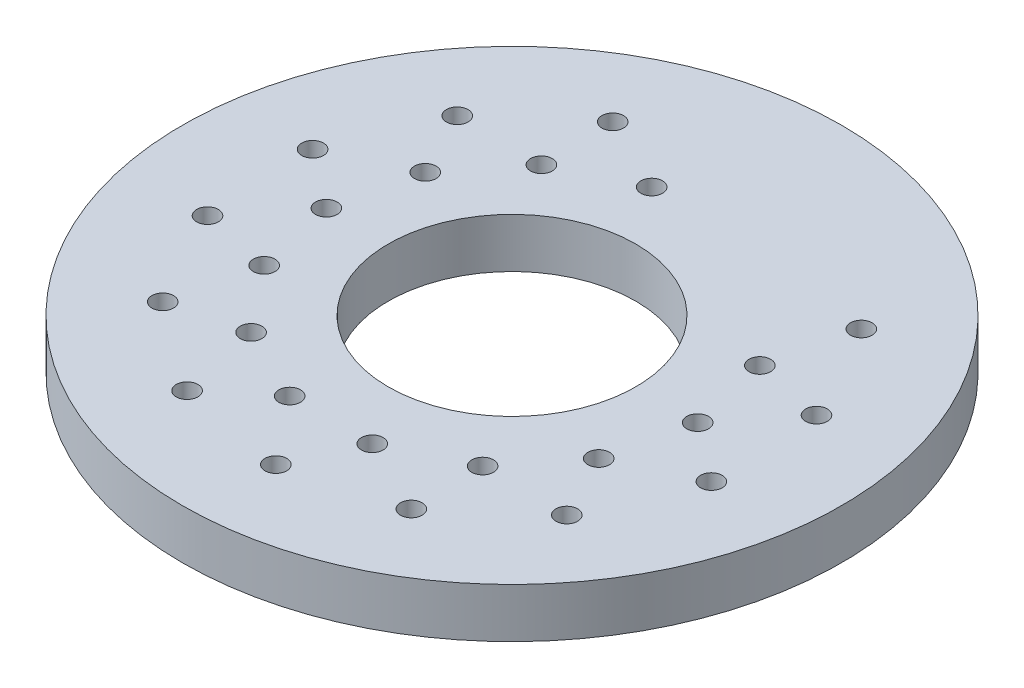
ISO-10303-21;
HEADER;
FILE_DESCRIPTION(('STEP AP214'),'2;1');
FILE_NAME('part.step','',(''),(''),'','','');
FILE_SCHEMA(('AUTOMOTIVE_DESIGN { 1 0 10303 214 1 1 1 1 }'));
ENDSEC;
DATA;
#1=APPLICATION_CONTEXT('core data for automotive mechanical design processes');
#2=APPLICATION_PROTOCOL_DEFINITION('international standard','automotive_design',2000,#1);
#3=PRODUCT_CONTEXT('',#1,'mechanical');
#4=PRODUCT('Part','Part','',(#3));
#5=PRODUCT_RELATED_PRODUCT_CATEGORY('part','',(#4));
#6=PRODUCT_DEFINITION_FORMATION('','',#4);
#7=PRODUCT_DEFINITION_CONTEXT('part definition',#1,'design');
#8=PRODUCT_DEFINITION('design','',#6,#7);
#9=PRODUCT_DEFINITION_SHAPE('','',#8);
#10=(LENGTH_UNIT() NAMED_UNIT(*) SI_UNIT(.MILLI.,.METRE.));
#11=(NAMED_UNIT(*) PLANE_ANGLE_UNIT() SI_UNIT($,.RADIAN.));
#12=(NAMED_UNIT(*) SI_UNIT($,.STERADIAN.) SOLID_ANGLE_UNIT());
#13=UNCERTAINTY_MEASURE_WITH_UNIT(LENGTH_MEASURE(1.E-05),#10,'distance_accuracy_value','');
#14=(GEOMETRIC_REPRESENTATION_CONTEXT(3) GLOBAL_UNCERTAINTY_ASSIGNED_CONTEXT((#13)) GLOBAL_UNIT_ASSIGNED_CONTEXT((#10,
#11,#12)) REPRESENTATION_CONTEXT('',''));
#15=CARTESIAN_POINT('',(0.,0.,0.));
#16=DIRECTION('',(0.,0.,1.));
#17=DIRECTION('',(1.,0.,0.));
#18=AXIS2_PLACEMENT_3D('',#15,#16,#17);
#19=CARTESIAN_POINT('',(-21.7363200137049,1.6,-18.9571139209193));
#20=DIRECTION('',(0.,-1.,0.));
#21=DIRECTION('',(0.,0.,-1.));
#22=AXIS2_PLACEMENT_3D('',#19,#20,#21);
#23=CYLINDRICAL_SURFACE('',#22,10.6500000000003);
#24=CARTESIAN_POINT('',(-21.7363200137049,1.6,-18.9571139209193));
#25=DIRECTION('',(0.,1.,0.));
#26=DIRECTION('',(0.,0.,1.));
#27=AXIS2_PLACEMENT_3D('',#24,#25,#26);
#28=CIRCLE('',#27,10.6500000000003);
#29=CARTESIAN_POINT('',(-21.7363200137049,1.6,-8.30711392091903));
#30=VERTEX_POINT('',#29);
#31=EDGE_CURVE('E10',#30,#30,#28,.T.);
#32=ORIENTED_EDGE('',*,*,#31,.F.);
#33=EDGE_LOOP('',(#32));
#34=FACE_BOUND('',#33,.T.);
#35=CARTESIAN_POINT('',(-21.7363200137049,0.,-18.9571139209193));
#36=DIRECTION('',(0.,1.,0.));
#37=DIRECTION('',(0.,0.,1.));
#38=AXIS2_PLACEMENT_3D('',#35,#36,#37);
#39=CIRCLE('',#38,10.6500000000003);
#40=CARTESIAN_POINT('',(-21.7363200137049,0.,-8.30711392091903));
#41=VERTEX_POINT('',#40);
#42=EDGE_CURVE('E37',#41,#41,#39,.T.);
#43=ORIENTED_EDGE('',*,*,#42,.T.);
#44=EDGE_LOOP('',(#43));
#45=FACE_BOUND('',#44,.T.);
#46=ADVANCED_FACE('F30',(#34,#45),#23,.T.);
#47=CARTESIAN_POINT('',(-21.7363200137049,1.6,-18.9571139209193));
#48=DIRECTION('',(0.,1.,0.));
#49=DIRECTION('',(0.,0.,1.));
#50=AXIS2_PLACEMENT_3D('',#47,#48,#49);
#51=PLANE('',#50);
#52=CARTESIAN_POINT('',(-21.377401370901,1.6,-10.9651693885888));
#53=DIRECTION('',(0.,1.,0.));
#54=DIRECTION('',(0.,0.,1.));
#55=AXIS2_PLACEMENT_3D('',#52,#53,#54);
#56=CIRCLE('',#55,0.350000000000001);
#57=CARTESIAN_POINT('',(-21.377401370901,1.6,-10.6151693885888));
#58=VERTEX_POINT('',#57);
#59=EDGE_CURVE('E100',#58,#58,#56,.T.);
#60=ORIENTED_EDGE('',*,*,#59,.F.);
#61=EDGE_LOOP('',(#60));
#62=FACE_BOUND('',#61,.T.);
#63=CARTESIAN_POINT('',(-17.9453707139211,1.6,-11.9123496660653));
#64=DIRECTION('',(0.,1.,0.));
#65=DIRECTION('',(0.,0.,1.));
#66=AXIS2_PLACEMENT_3D('',#63,#64,#65);
#67=CIRCLE('',#66,0.350000000000004);
#68=CARTESIAN_POINT('',(-17.9453707139211,1.6,-11.5623496660653));
#69=VERTEX_POINT('',#68);
#70=EDGE_CURVE('E90',#69,#69,#67,.T.);
#71=ORIENTED_EDGE('',*,*,#70,.F.);
#72=EDGE_LOOP('',(#71));
#73=FACE_BOUND('',#72,.T.);
#74=CARTESIAN_POINT('',(-15.2641840587054,1.6,-14.2548319025794));
#75=DIRECTION('',(0.,1.,0.));
#76=DIRECTION('',(0.,0.,1.));
#77=AXIS2_PLACEMENT_3D('',#74,#75,#76);
#78=CIRCLE('',#77,0.350000000000006);
#79=CARTESIAN_POINT('',(-15.2641840587054,1.6,-13.9048319025794));
#80=VERTEX_POINT('',#79);
#81=EDGE_CURVE('E87',#80,#80,#78,.T.);
#82=ORIENTED_EDGE('',*,*,#81,.F.);
#83=EDGE_LOOP('',(#82));
#84=FACE_BOUND('',#83,.T.);
#85=CARTESIAN_POINT('',(-13.8648833049159,1.6,-17.5286587625301));
#86=DIRECTION('',(0.,1.,0.));
#87=DIRECTION('',(0.,0.,1.));
#88=AXIS2_PLACEMENT_3D('',#85,#86,#87);
#89=CIRCLE('',#88,0.350000000000001);
#90=CARTESIAN_POINT('',(-13.8648833049159,1.6,-17.1786587625301));
#91=VERTEX_POINT('',#90);
#92=EDGE_CURVE('E84',#91,#91,#89,.T.);
#93=ORIENTED_EDGE('',*,*,#92,.F.);
#94=EDGE_LOOP('',(#93));
#95=FACE_BOUND('',#94,.T.);
#96=CARTESIAN_POINT('',(-24.8805202669364,1.6,-11.6008917405077));
#97=DIRECTION('',(0.,1.,0.));
#98=DIRECTION('',(0.,0.,1.));
#99=AXIS2_PLACEMENT_3D('',#96,#97,#98);
#100=CIRCLE('',#99,0.350000000000002);
#101=CARTESIAN_POINT('',(-24.8805202669364,1.6,-11.2508917405077));
#102=VERTEX_POINT('',#101);
#103=EDGE_CURVE('E80',#102,#102,#100,.T.);
#104=ORIENTED_EDGE('',*,*,#103,.F.);
#105=EDGE_LOOP('',(#104));
#106=FACE_BOUND('',#105,.T.);
#107=CARTESIAN_POINT('',(-14.024617128138,1.6,-21.0854086854526));
#108=DIRECTION('',(0.,1.,0.));
#109=DIRECTION('',(0.,0.,1.));
#110=AXIS2_PLACEMENT_3D('',#107,#108,#109);
#111=CIRCLE('',#110,0.350000000000003);
#112=CARTESIAN_POINT('',(-14.024617128138,1.6,-20.7354086854526));
#113=VERTEX_POINT('',#112);
#114=EDGE_CURVE('E76',#113,#113,#111,.T.);
#115=ORIENTED_EDGE('',*,*,#114,.F.);
#116=EDGE_LOOP('',(#115));
#117=FACE_BOUND('',#116,.T.);
#118=CARTESIAN_POINT('',(-15.7117482856759,1.6,-24.2206237284369));
#119=DIRECTION('',(0.,1.,0.));
#120=DIRECTION('',(0.,0.,1.));
#121=AXIS2_PLACEMENT_3D('',#118,#119,#120);
#122=CIRCLE('',#121,0.350000000000001);
#123=CARTESIAN_POINT('',(-15.7117482856759,1.6,-23.8706237284369));
#124=VERTEX_POINT('',#123);
#125=EDGE_CURVE('E72',#124,#124,#122,.T.);
#126=ORIENTED_EDGE('',*,*,#125,.F.);
#127=EDGE_LOOP('',(#126));
#128=FACE_BOUND('',#127,.T.);
#129=CARTESIAN_POINT('',(-25.5272693134888,1.6,-26.0018781757733));
#130=DIRECTION('',(0.,1.,0.));
#131=DIRECTION('',(0.,0.,1.));
#132=AXIS2_PLACEMENT_3D('',#129,#130,#131);
#133=CIRCLE('',#132,0.350000000000001);
#134=CARTESIAN_POINT('',(-25.5272693134888,1.6,-25.6518781757733));
#135=VERTEX_POINT('',#134);
#136=EDGE_CURVE('E68',#135,#135,#133,.T.);
#137=ORIENTED_EDGE('',*,*,#136,.F.);
#138=EDGE_LOOP('',(#137));
#139=FACE_BOUND('',#138,.T.);
#140=CARTESIAN_POINT('',(-28.2084559687044,1.6,-23.6593959392592));
#141=DIRECTION('',(0.,1.,0.));
#142=DIRECTION('',(0.,0.,1.));
#143=AXIS2_PLACEMENT_3D('',#140,#141,#142);
#144=CIRCLE('',#143,0.350000000000001);
#145=CARTESIAN_POINT('',(-28.2084559687044,1.6,-23.3093959392592));
#146=VERTEX_POINT('',#145);
#147=EDGE_CURVE('E64',#146,#146,#144,.T.);
#148=ORIENTED_EDGE('',*,*,#147,.F.);
#149=EDGE_LOOP('',(#148));
#150=FACE_BOUND('',#149,.T.);
#151=CARTESIAN_POINT('',(-29.6077567224939,1.6,-20.3855690793085));
#152=DIRECTION('',(0.,1.,0.));
#153=DIRECTION('',(0.,0.,1.));
#154=AXIS2_PLACEMENT_3D('',#151,#152,#153);
#155=CIRCLE('',#154,0.350000000000001);
#156=CARTESIAN_POINT('',(-29.6077567224939,1.6,-20.0355690793085));
#157=VERTEX_POINT('',#156);
#158=EDGE_CURVE('E60',#157,#157,#155,.T.);
#159=ORIENTED_EDGE('',*,*,#158,.F.);
#160=EDGE_LOOP('',(#159));
#161=FACE_BOUND('',#160,.T.);
#162=CARTESIAN_POINT('',(-29.4480228992717,1.6,-16.828819156386));
#163=DIRECTION('',(0.,1.,0.));
#164=DIRECTION('',(0.,0.,1.));
#165=AXIS2_PLACEMENT_3D('',#162,#163,#164);
#166=CIRCLE('',#165,0.349999999999998);
#167=CARTESIAN_POINT('',(-29.4480228992717,1.6,-16.478819156386));
#168=VERTEX_POINT('',#167);
#169=EDGE_CURVE('E56',#168,#168,#166,.T.);
#170=ORIENTED_EDGE('',*,*,#169,.F.);
#171=EDGE_LOOP('',(#170));
#172=FACE_BOUND('',#171,.T.);
#173=CARTESIAN_POINT('',(-27.7608917417338,1.6,-13.6936041134017));
#174=DIRECTION('',(0.,1.,0.));
#175=DIRECTION('',(0.,0.,1.));
#176=AXIS2_PLACEMENT_3D('',#173,#174,#175);
#177=CIRCLE('',#176,0.350000000000001);
#178=CARTESIAN_POINT('',(-27.7608917417338,1.6,-13.3436041134017));
#179=VERTEX_POINT('',#178);
#180=EDGE_CURVE('E52',#179,#179,#177,.T.);
#181=ORIENTED_EDGE('',*,*,#180,.F.);
#182=EDGE_LOOP('',(#181));
#183=FACE_BOUND('',#182,.T.);
#184=CARTESIAN_POINT('',(-21.7363200137049,1.6,-18.9571139209193));
#185=DIRECTION('',(0.,1.,0.));
#186=DIRECTION('',(0.,0.,1.));
#187=AXIS2_PLACEMENT_3D('',#184,#185,#186);
#188=CIRCLE('',#187,4.);
#189=CARTESIAN_POINT('',(-21.7363200137049,1.6,-14.9571139209193));
#190=VERTEX_POINT('',#189);
#191=EDGE_CURVE('E51',#190,#190,#188,.T.);
#192=ORIENTED_EDGE('',*,*,#191,.F.);
#193=EDGE_LOOP('',(#192));
#194=FACE_BOUND('',#193,.T.);
#195=CARTESIAN_POINT('',(-27.1421332211194,1.6,-16.353811486214));
#196=DIRECTION('',(0.,1.,0.));
#197=DIRECTION('',(0.,0.,1.));
#198=AXIS2_PLACEMENT_3D('',#195,#196,#197);
#199=CIRCLE('',#198,0.350000000000003);
#200=CARTESIAN_POINT('',(-27.1421332211194,1.6,-16.003811486214));
#201=VERTEX_POINT('',#200);
#202=EDGE_CURVE('E124',#201,#201,#199,.T.);
#203=ORIENTED_EDGE('',*,*,#202,.F.);
#204=EDGE_LOOP('',(#203));
#205=FACE_BOUND('',#204,.T.);
#206=CARTESIAN_POINT('',(-27.7363200137049,1.6,-18.9571139209193));
#207=DIRECTION('',(0.,1.,0.));
#208=DIRECTION('',(0.,0.,1.));
#209=AXIS2_PLACEMENT_3D('',#206,#207,#208);
#210=CIRCLE('',#209,0.350000000000001);
#211=CARTESIAN_POINT('',(-27.7363200137049,1.6,-18.6071139209193));
#212=VERTEX_POINT('',#211);
#213=EDGE_CURVE('E130',#212,#212,#210,.T.);
#214=ORIENTED_EDGE('',*,*,#213,.F.);
#215=EDGE_LOOP('',(#214));
#216=FACE_BOUND('',#215,.T.);
#217=CARTESIAN_POINT('',(-25.4772588248574,1.6,-14.2661250261112));
#218=DIRECTION('',(0.,1.,0.));
#219=DIRECTION('',(0.,0.,1.));
#220=AXIS2_PLACEMENT_3D('',#217,#218,#219);
#221=CIRCLE('',#220,0.350000000000002);
#222=CARTESIAN_POINT('',(-25.4772588248574,1.6,-13.9161250261112));
#223=VERTEX_POINT('',#222);
#224=EDGE_CURVE('E136',#223,#223,#221,.T.);
#225=ORIENTED_EDGE('',*,*,#224,.F.);
#226=EDGE_LOOP('',(#225));
#227=FACE_BOUND('',#226,.T.);
#228=CARTESIAN_POINT('',(-23.0714456174428,1.6,-13.1075464478284));
#229=DIRECTION('',(0.,1.,0.));
#230=DIRECTION('',(0.,0.,1.));
#231=AXIS2_PLACEMENT_3D('',#228,#229,#230);
#232=CIRCLE('',#231,0.349999999999998);
#233=CARTESIAN_POINT('',(-23.0714456174428,1.6,-12.7575464478284));
#234=VERTEX_POINT('',#233);
#235=EDGE_CURVE('E142',#234,#234,#232,.T.);
#236=ORIENTED_EDGE('',*,*,#235,.F.);
#237=EDGE_LOOP('',(#236));
#238=FACE_BOUND('',#237,.T.);
#239=CARTESIAN_POINT('',(-20.4011944099671,1.6,-13.1075464478283));
#240=DIRECTION('',(0.,1.,0.));
#241=DIRECTION('',(0.,0.,1.));
#242=AXIS2_PLACEMENT_3D('',#239,#240,#241);
#243=CIRCLE('',#242,0.350000000000002);
#244=CARTESIAN_POINT('',(-20.4011944099671,1.6,-12.7575464478283));
#245=VERTEX_POINT('',#244);
#246=EDGE_CURVE('E148',#245,#245,#243,.T.);
#247=ORIENTED_EDGE('',*,*,#246,.F.);
#248=EDGE_LOOP('',(#247));
#249=FACE_BOUND('',#248,.T.);
#250=CARTESIAN_POINT('',(-17.9953812025525,1.6,-14.2661250261111));
#251=DIRECTION('',(0.,1.,0.));
#252=DIRECTION('',(0.,0.,1.));
#253=AXIS2_PLACEMENT_3D('',#250,#251,#252);
#254=CIRCLE('',#253,0.349999999999999);
#255=CARTESIAN_POINT('',(-17.9953812025525,1.6,-13.9161250261111));
#256=VERTEX_POINT('',#255);
#257=EDGE_CURVE('E154',#256,#256,#254,.T.);
#258=ORIENTED_EDGE('',*,*,#257,.F.);
#259=EDGE_LOOP('',(#258));
#260=FACE_BOUND('',#259,.T.);
#261=CARTESIAN_POINT('',(-16.3305068062904,1.6,-16.3538114862139));
#262=DIRECTION('',(0.,1.,0.));
#263=DIRECTION('',(0.,0.,1.));
#264=AXIS2_PLACEMENT_3D('',#261,#262,#263);
#265=CIRCLE('',#264,0.349999999999998);
#266=CARTESIAN_POINT('',(-16.3305068062904,1.6,-16.0038114862139));
#267=VERTEX_POINT('',#266);
#268=EDGE_CURVE('E160',#267,#267,#265,.T.);
#269=ORIENTED_EDGE('',*,*,#268,.F.);
#270=EDGE_LOOP('',(#269));
#271=FACE_BOUND('',#270,.T.);
#272=CARTESIAN_POINT('',(-15.7363200137049,1.6,-18.9571139209193));
#273=DIRECTION('',(0.,1.,0.));
#274=DIRECTION('',(0.,0.,1.));
#275=AXIS2_PLACEMENT_3D('',#272,#273,#274);
#276=CIRCLE('',#275,0.35);
#277=CARTESIAN_POINT('',(-15.7363200137049,1.6,-18.6071139209193));
#278=VERTEX_POINT('',#277);
#279=EDGE_CURVE('E166',#278,#278,#276,.T.);
#280=ORIENTED_EDGE('',*,*,#279,.F.);
#281=EDGE_LOOP('',(#280));
#282=FACE_BOUND('',#281,.T.);
#283=CARTESIAN_POINT('',(-16.3305068062904,1.6,-21.5604163556246));
#284=DIRECTION('',(0.,1.,0.));
#285=DIRECTION('',(0.,0.,1.));
#286=AXIS2_PLACEMENT_3D('',#283,#284,#285);
#287=CIRCLE('',#286,0.350000000000005);
#288=CARTESIAN_POINT('',(-16.3305068062904,1.6,-21.2104163556246));
#289=VERTEX_POINT('',#288);
#290=EDGE_CURVE('E172',#289,#289,#287,.T.);
#291=ORIENTED_EDGE('',*,*,#290,.F.);
#292=EDGE_LOOP('',(#291));
#293=FACE_BOUND('',#292,.T.);
#294=CARTESIAN_POINT('',(-23.0714456174428,1.6,-24.8066813940103));
#295=DIRECTION('',(0.,1.,0.));
#296=DIRECTION('',(0.,0.,1.));
#297=AXIS2_PLACEMENT_3D('',#294,#295,#296);
#298=CIRCLE('',#297,0.350000000000003);
#299=CARTESIAN_POINT('',(-23.0714456174428,1.6,-24.4566813940103));
#300=VERTEX_POINT('',#299);
#301=EDGE_CURVE('E178',#300,#300,#298,.T.);
#302=ORIENTED_EDGE('',*,*,#301,.F.);
#303=EDGE_LOOP('',(#302));
#304=FACE_BOUND('',#303,.T.);
#305=CARTESIAN_POINT('',(-25.4772588248573,1.6,-23.6481028157275));
#306=DIRECTION('',(0.,1.,0.));
#307=DIRECTION('',(0.,0.,1.));
#308=AXIS2_PLACEMENT_3D('',#305,#306,#307);
#309=CIRCLE('',#308,0.349999999999999);
#310=CARTESIAN_POINT('',(-25.4772588248573,1.6,-23.2981028157275));
#311=VERTEX_POINT('',#310);
#312=EDGE_CURVE('E184',#311,#311,#309,.T.);
#313=ORIENTED_EDGE('',*,*,#312,.F.);
#314=EDGE_LOOP('',(#313));
#315=FACE_BOUND('',#314,.T.);
#316=CARTESIAN_POINT('',(-27.1421332211194,1.6,-21.5604163556247));
#317=DIRECTION('',(0.,1.,0.));
#318=DIRECTION('',(0.,0.,1.));
#319=AXIS2_PLACEMENT_3D('',#316,#317,#318);
#320=CIRCLE('',#319,0.349999999999998);
#321=CARTESIAN_POINT('',(-27.1421332211194,1.6,-21.2104163556247));
#322=VERTEX_POINT('',#321);
#323=EDGE_CURVE('E45',#322,#322,#320,.T.);
#324=ORIENTED_EDGE('',*,*,#323,.F.);
#325=EDGE_LOOP('',(#324));
#326=FACE_BOUND('',#325,.T.);
#327=ORIENTED_EDGE('',*,*,#31,.T.);
#328=EDGE_LOOP('',(#327));
#329=FACE_BOUND('',#328,.T.);
#330=ADVANCED_FACE('F199',(#62,#73,#84,#95,#106,#117,#128,#139,#150,#161,#172,#183,#194,#205,
#216,#227,#238,#249,#260,#271,#282,#293,#304,#315,#326,#329),#51,.T.);
#331=CARTESIAN_POINT('',(-21.7363200137049,0.,-18.9571139209193));
#332=DIRECTION('',(0.,1.,0.));
#333=DIRECTION('',(0.,0.,1.));
#334=AXIS2_PLACEMENT_3D('',#331,#332,#333);
#335=PLANE('',#334);
#336=CARTESIAN_POINT('',(-21.377401370901,0.,-10.9651693885888));
#337=DIRECTION('',(0.,1.,0.));
#338=DIRECTION('',(0.,0.,1.));
#339=AXIS2_PLACEMENT_3D('',#336,#337,#338);
#340=CIRCLE('',#339,0.350000000000001);
#341=CARTESIAN_POINT('',(-21.377401370901,0.,-10.6151693885888));
#342=VERTEX_POINT('',#341);
#343=EDGE_CURVE('E33',#342,#342,#340,.T.);
#344=ORIENTED_EDGE('',*,*,#343,.T.);
#345=EDGE_LOOP('',(#344));
#346=FACE_BOUND('',#345,.T.);
#347=CARTESIAN_POINT('',(-17.9453707139211,0.,-11.9123496660653));
#348=DIRECTION('',(0.,1.,0.));
#349=DIRECTION('',(0.,0.,1.));
#350=AXIS2_PLACEMENT_3D('',#347,#348,#349);
#351=CIRCLE('',#350,0.350000000000004);
#352=CARTESIAN_POINT('',(-17.9453707139211,0.,-11.5623496660653));
#353=VERTEX_POINT('',#352);
#354=EDGE_CURVE('E88',#353,#353,#351,.T.);
#355=ORIENTED_EDGE('',*,*,#354,.T.);
#356=EDGE_LOOP('',(#355));
#357=FACE_BOUND('',#356,.T.);
#358=CARTESIAN_POINT('',(-15.2641840587054,0.,-14.2548319025794));
#359=DIRECTION('',(0.,1.,0.));
#360=DIRECTION('',(0.,0.,1.));
#361=AXIS2_PLACEMENT_3D('',#358,#359,#360);
#362=CIRCLE('',#361,0.350000000000006);
#363=CARTESIAN_POINT('',(-15.2641840587054,0.,-13.9048319025794));
#364=VERTEX_POINT('',#363);
#365=EDGE_CURVE('E85',#364,#364,#362,.T.);
#366=ORIENTED_EDGE('',*,*,#365,.T.);
#367=EDGE_LOOP('',(#366));
#368=FACE_BOUND('',#367,.T.);
#369=CARTESIAN_POINT('',(-13.8648833049159,0.,-17.5286587625301));
#370=DIRECTION('',(0.,1.,0.));
#371=DIRECTION('',(0.,0.,1.));
#372=AXIS2_PLACEMENT_3D('',#369,#370,#371);
#373=CIRCLE('',#372,0.350000000000001);
#374=CARTESIAN_POINT('',(-13.8648833049159,0.,-17.1786587625301));
#375=VERTEX_POINT('',#374);
#376=EDGE_CURVE('E81',#375,#375,#373,.T.);
#377=ORIENTED_EDGE('',*,*,#376,.T.);
#378=EDGE_LOOP('',(#377));
#379=FACE_BOUND('',#378,.T.);
#380=CARTESIAN_POINT('',(-24.8805202669364,0.,-11.6008917405077));
#381=DIRECTION('',(0.,1.,0.));
#382=DIRECTION('',(0.,0.,1.));
#383=AXIS2_PLACEMENT_3D('',#380,#381,#382);
#384=CIRCLE('',#383,0.350000000000002);
#385=CARTESIAN_POINT('',(-24.8805202669364,0.,-11.2508917405077));
#386=VERTEX_POINT('',#385);
#387=EDGE_CURVE('E77',#386,#386,#384,.T.);
#388=ORIENTED_EDGE('',*,*,#387,.T.);
#389=EDGE_LOOP('',(#388));
#390=FACE_BOUND('',#389,.T.);
#391=CARTESIAN_POINT('',(-14.024617128138,0.,-21.0854086854526));
#392=DIRECTION('',(0.,1.,0.));
#393=DIRECTION('',(0.,0.,1.));
#394=AXIS2_PLACEMENT_3D('',#391,#392,#393);
#395=CIRCLE('',#394,0.350000000000003);
#396=CARTESIAN_POINT('',(-14.024617128138,0.,-20.7354086854526));
#397=VERTEX_POINT('',#396);
#398=EDGE_CURVE('E73',#397,#397,#395,.T.);
#399=ORIENTED_EDGE('',*,*,#398,.T.);
#400=EDGE_LOOP('',(#399));
#401=FACE_BOUND('',#400,.T.);
#402=CARTESIAN_POINT('',(-15.7117482856759,0.,-24.2206237284369));
#403=DIRECTION('',(0.,1.,0.));
#404=DIRECTION('',(0.,0.,1.));
#405=AXIS2_PLACEMENT_3D('',#402,#403,#404);
#406=CIRCLE('',#405,0.350000000000001);
#407=CARTESIAN_POINT('',(-15.7117482856759,0.,-23.8706237284369));
#408=VERTEX_POINT('',#407);
#409=EDGE_CURVE('E69',#408,#408,#406,.T.);
#410=ORIENTED_EDGE('',*,*,#409,.T.);
#411=EDGE_LOOP('',(#410));
#412=FACE_BOUND('',#411,.T.);
#413=CARTESIAN_POINT('',(-25.5272693134888,0.,-26.0018781757733));
#414=DIRECTION('',(0.,1.,0.));
#415=DIRECTION('',(0.,0.,1.));
#416=AXIS2_PLACEMENT_3D('',#413,#414,#415);
#417=CIRCLE('',#416,0.350000000000001);
#418=CARTESIAN_POINT('',(-25.5272693134888,0.,-25.6518781757733));
#419=VERTEX_POINT('',#418);
#420=EDGE_CURVE('E65',#419,#419,#417,.T.);
#421=ORIENTED_EDGE('',*,*,#420,.T.);
#422=EDGE_LOOP('',(#421));
#423=FACE_BOUND('',#422,.T.);
#424=CARTESIAN_POINT('',(-28.2084559687044,0.,-23.6593959392592));
#425=DIRECTION('',(0.,1.,0.));
#426=DIRECTION('',(0.,0.,1.));
#427=AXIS2_PLACEMENT_3D('',#424,#425,#426);
#428=CIRCLE('',#427,0.350000000000001);
#429=CARTESIAN_POINT('',(-28.2084559687044,0.,-23.3093959392592));
#430=VERTEX_POINT('',#429);
#431=EDGE_CURVE('E61',#430,#430,#428,.T.);
#432=ORIENTED_EDGE('',*,*,#431,.T.);
#433=EDGE_LOOP('',(#432));
#434=FACE_BOUND('',#433,.T.);
#435=CARTESIAN_POINT('',(-29.6077567224939,0.,-20.3855690793085));
#436=DIRECTION('',(0.,1.,0.));
#437=DIRECTION('',(0.,0.,1.));
#438=AXIS2_PLACEMENT_3D('',#435,#436,#437);
#439=CIRCLE('',#438,0.350000000000001);
#440=CARTESIAN_POINT('',(-29.6077567224939,0.,-20.0355690793085));
#441=VERTEX_POINT('',#440);
#442=EDGE_CURVE('E57',#441,#441,#439,.T.);
#443=ORIENTED_EDGE('',*,*,#442,.T.);
#444=EDGE_LOOP('',(#443));
#445=FACE_BOUND('',#444,.T.);
#446=CARTESIAN_POINT('',(-29.4480228992717,0.,-16.828819156386));
#447=DIRECTION('',(0.,1.,0.));
#448=DIRECTION('',(0.,0.,1.));
#449=AXIS2_PLACEMENT_3D('',#446,#447,#448);
#450=CIRCLE('',#449,0.349999999999998);
#451=CARTESIAN_POINT('',(-29.4480228992717,0.,-16.478819156386));
#452=VERTEX_POINT('',#451);
#453=EDGE_CURVE('E53',#452,#452,#450,.T.);
#454=ORIENTED_EDGE('',*,*,#453,.T.);
#455=EDGE_LOOP('',(#454));
#456=FACE_BOUND('',#455,.T.);
#457=CARTESIAN_POINT('',(-27.7608917417338,0.,-13.6936041134017));
#458=DIRECTION('',(0.,1.,0.));
#459=DIRECTION('',(0.,0.,1.));
#460=AXIS2_PLACEMENT_3D('',#457,#458,#459);
#461=CIRCLE('',#460,0.350000000000001);
#462=CARTESIAN_POINT('',(-27.7608917417338,0.,-13.3436041134017));
#463=VERTEX_POINT('',#462);
#464=EDGE_CURVE('E48',#463,#463,#461,.T.);
#465=ORIENTED_EDGE('',*,*,#464,.T.);
#466=EDGE_LOOP('',(#465));
#467=FACE_BOUND('',#466,.T.);
#468=CARTESIAN_POINT('',(-21.7363200137049,0.,-18.9571139209193));
#469=DIRECTION('',(0.,1.,0.));
#470=DIRECTION('',(0.,0.,1.));
#471=AXIS2_PLACEMENT_3D('',#468,#469,#470);
#472=CIRCLE('',#471,4.);
#473=CARTESIAN_POINT('',(-21.7363200137049,0.,-14.9571139209193));
#474=VERTEX_POINT('',#473);
#475=EDGE_CURVE('E121',#474,#474,#472,.T.);
#476=ORIENTED_EDGE('',*,*,#475,.T.);
#477=EDGE_LOOP('',(#476));
#478=FACE_BOUND('',#477,.T.);
#479=CARTESIAN_POINT('',(-27.1421332211194,0.,-16.353811486214));
#480=DIRECTION('',(0.,1.,0.));
#481=DIRECTION('',(0.,0.,1.));
#482=AXIS2_PLACEMENT_3D('',#479,#480,#481);
#483=CIRCLE('',#482,0.350000000000003);
#484=CARTESIAN_POINT('',(-27.1421332211194,0.,-16.003811486214));
#485=VERTEX_POINT('',#484);
#486=EDGE_CURVE('E127',#485,#485,#483,.T.);
#487=ORIENTED_EDGE('',*,*,#486,.T.);
#488=EDGE_LOOP('',(#487));
#489=FACE_BOUND('',#488,.T.);
#490=CARTESIAN_POINT('',(-27.7363200137049,0.,-18.9571139209193));
#491=DIRECTION('',(0.,1.,0.));
#492=DIRECTION('',(0.,0.,1.));
#493=AXIS2_PLACEMENT_3D('',#490,#491,#492);
#494=CIRCLE('',#493,0.350000000000001);
#495=CARTESIAN_POINT('',(-27.7363200137049,0.,-18.6071139209193));
#496=VERTEX_POINT('',#495);
#497=EDGE_CURVE('E133',#496,#496,#494,.T.);
#498=ORIENTED_EDGE('',*,*,#497,.T.);
#499=EDGE_LOOP('',(#498));
#500=FACE_BOUND('',#499,.T.);
#501=CARTESIAN_POINT('',(-25.4772588248574,0.,-14.2661250261112));
#502=DIRECTION('',(0.,1.,0.));
#503=DIRECTION('',(0.,0.,1.));
#504=AXIS2_PLACEMENT_3D('',#501,#502,#503);
#505=CIRCLE('',#504,0.350000000000002);
#506=CARTESIAN_POINT('',(-25.4772588248574,0.,-13.9161250261112));
#507=VERTEX_POINT('',#506);
#508=EDGE_CURVE('E139',#507,#507,#505,.T.);
#509=ORIENTED_EDGE('',*,*,#508,.T.);
#510=EDGE_LOOP('',(#509));
#511=FACE_BOUND('',#510,.T.);
#512=CARTESIAN_POINT('',(-23.0714456174428,0.,-13.1075464478284));
#513=DIRECTION('',(0.,1.,0.));
#514=DIRECTION('',(0.,0.,1.));
#515=AXIS2_PLACEMENT_3D('',#512,#513,#514);
#516=CIRCLE('',#515,0.349999999999998);
#517=CARTESIAN_POINT('',(-23.0714456174428,0.,-12.7575464478284));
#518=VERTEX_POINT('',#517);
#519=EDGE_CURVE('E145',#518,#518,#516,.T.);
#520=ORIENTED_EDGE('',*,*,#519,.T.);
#521=EDGE_LOOP('',(#520));
#522=FACE_BOUND('',#521,.T.);
#523=CARTESIAN_POINT('',(-20.4011944099671,0.,-13.1075464478283));
#524=DIRECTION('',(0.,1.,0.));
#525=DIRECTION('',(0.,0.,1.));
#526=AXIS2_PLACEMENT_3D('',#523,#524,#525);
#527=CIRCLE('',#526,0.350000000000002);
#528=CARTESIAN_POINT('',(-20.4011944099671,0.,-12.7575464478283));
#529=VERTEX_POINT('',#528);
#530=EDGE_CURVE('E151',#529,#529,#527,.T.);
#531=ORIENTED_EDGE('',*,*,#530,.T.);
#532=EDGE_LOOP('',(#531));
#533=FACE_BOUND('',#532,.T.);
#534=CARTESIAN_POINT('',(-17.9953812025525,0.,-14.2661250261111));
#535=DIRECTION('',(0.,1.,0.));
#536=DIRECTION('',(0.,0.,1.));
#537=AXIS2_PLACEMENT_3D('',#534,#535,#536);
#538=CIRCLE('',#537,0.349999999999999);
#539=CARTESIAN_POINT('',(-17.9953812025525,0.,-13.9161250261111));
#540=VERTEX_POINT('',#539);
#541=EDGE_CURVE('E157',#540,#540,#538,.T.);
#542=ORIENTED_EDGE('',*,*,#541,.T.);
#543=EDGE_LOOP('',(#542));
#544=FACE_BOUND('',#543,.T.);
#545=CARTESIAN_POINT('',(-16.3305068062904,0.,-16.3538114862139));
#546=DIRECTION('',(0.,1.,0.));
#547=DIRECTION('',(0.,0.,1.));
#548=AXIS2_PLACEMENT_3D('',#545,#546,#547);
#549=CIRCLE('',#548,0.349999999999998);
#550=CARTESIAN_POINT('',(-16.3305068062904,0.,-16.0038114862139));
#551=VERTEX_POINT('',#550);
#552=EDGE_CURVE('E163',#551,#551,#549,.T.);
#553=ORIENTED_EDGE('',*,*,#552,.T.);
#554=EDGE_LOOP('',(#553));
#555=FACE_BOUND('',#554,.T.);
#556=CARTESIAN_POINT('',(-15.7363200137049,0.,-18.9571139209193));
#557=DIRECTION('',(0.,1.,0.));
#558=DIRECTION('',(0.,0.,1.));
#559=AXIS2_PLACEMENT_3D('',#556,#557,#558);
#560=CIRCLE('',#559,0.35);
#561=CARTESIAN_POINT('',(-15.7363200137049,0.,-18.6071139209193));
#562=VERTEX_POINT('',#561);
#563=EDGE_CURVE('E169',#562,#562,#560,.T.);
#564=ORIENTED_EDGE('',*,*,#563,.T.);
#565=EDGE_LOOP('',(#564));
#566=FACE_BOUND('',#565,.T.);
#567=CARTESIAN_POINT('',(-16.3305068062904,0.,-21.5604163556246));
#568=DIRECTION('',(0.,1.,0.));
#569=DIRECTION('',(0.,0.,1.));
#570=AXIS2_PLACEMENT_3D('',#567,#568,#569);
#571=CIRCLE('',#570,0.350000000000005);
#572=CARTESIAN_POINT('',(-16.3305068062904,0.,-21.2104163556246));
#573=VERTEX_POINT('',#572);
#574=EDGE_CURVE('E175',#573,#573,#571,.T.);
#575=ORIENTED_EDGE('',*,*,#574,.T.);
#576=EDGE_LOOP('',(#575));
#577=FACE_BOUND('',#576,.T.);
#578=CARTESIAN_POINT('',(-23.0714456174428,0.,-24.8066813940103));
#579=DIRECTION('',(0.,1.,0.));
#580=DIRECTION('',(0.,0.,1.));
#581=AXIS2_PLACEMENT_3D('',#578,#579,#580);
#582=CIRCLE('',#581,0.350000000000003);
#583=CARTESIAN_POINT('',(-23.0714456174428,0.,-24.4566813940103));
#584=VERTEX_POINT('',#583);
#585=EDGE_CURVE('E181',#584,#584,#582,.T.);
#586=ORIENTED_EDGE('',*,*,#585,.T.);
#587=EDGE_LOOP('',(#586));
#588=FACE_BOUND('',#587,.T.);
#589=CARTESIAN_POINT('',(-25.4772588248573,0.,-23.6481028157275));
#590=DIRECTION('',(0.,1.,0.));
#591=DIRECTION('',(0.,0.,1.));
#592=AXIS2_PLACEMENT_3D('',#589,#590,#591);
#593=CIRCLE('',#592,0.349999999999999);
#594=CARTESIAN_POINT('',(-25.4772588248573,0.,-23.2981028157275));
#595=VERTEX_POINT('',#594);
#596=EDGE_CURVE('E187',#595,#595,#593,.T.);
#597=ORIENTED_EDGE('',*,*,#596,.T.);
#598=EDGE_LOOP('',(#597));
#599=FACE_BOUND('',#598,.T.);
#600=CARTESIAN_POINT('',(-27.1421332211194,0.,-21.5604163556247));
#601=DIRECTION('',(0.,1.,0.));
#602=DIRECTION('',(0.,0.,1.));
#603=AXIS2_PLACEMENT_3D('',#600,#601,#602);
#604=CIRCLE('',#603,0.349999999999998);
#605=CARTESIAN_POINT('',(-27.1421332211194,0.,-21.2104163556247));
#606=VERTEX_POINT('',#605);
#607=EDGE_CURVE('E42',#606,#606,#604,.T.);
#608=ORIENTED_EDGE('',*,*,#607,.T.);
#609=EDGE_LOOP('',(#608));
#610=FACE_BOUND('',#609,.T.);
#611=ORIENTED_EDGE('',*,*,#42,.F.);
#612=EDGE_LOOP('',(#611));
#613=FACE_BOUND('',#612,.T.);
#614=ADVANCED_FACE('F201',(#346,#357,#368,#379,#390,#401,#412,#423,#434,#445,#456,#467,#478,
#489,#500,#511,#522,#533,#544,#555,#566,#577,#588,#599,#610,#613),#335,.F.);
#615=CARTESIAN_POINT('',(-27.1421332211194,0.,-21.5604163556247));
#616=DIRECTION('',(0.,1.,0.));
#617=DIRECTION('',(0.,0.,1.));
#618=AXIS2_PLACEMENT_3D('',#615,#616,#617);
#619=CYLINDRICAL_SURFACE('',#618,0.349999999999998);
#620=ORIENTED_EDGE('',*,*,#607,.F.);
#621=EDGE_LOOP('',(#620));
#622=FACE_BOUND('',#621,.T.);
#623=ORIENTED_EDGE('',*,*,#323,.T.);
#624=EDGE_LOOP('',(#623));
#625=FACE_BOUND('',#624,.T.);
#626=ADVANCED_FACE('F197',(#622,#625),#619,.F.);
#627=CARTESIAN_POINT('',(-25.4772588248573,0.,-23.6481028157275));
#628=DIRECTION('',(0.,1.,0.));
#629=DIRECTION('',(0.,0.,1.));
#630=AXIS2_PLACEMENT_3D('',#627,#628,#629);
#631=CYLINDRICAL_SURFACE('',#630,0.349999999999999);
#632=ORIENTED_EDGE('',*,*,#596,.F.);
#633=EDGE_LOOP('',(#632));
#634=FACE_BOUND('',#633,.T.);
#635=ORIENTED_EDGE('',*,*,#312,.T.);
#636=EDGE_LOOP('',(#635));
#637=FACE_BOUND('',#636,.T.);
#638=ADVANCED_FACE('F215',(#634,#637),#631,.F.);
#639=CARTESIAN_POINT('',(-23.0714456174428,0.,-24.8066813940103));
#640=DIRECTION('',(0.,1.,0.));
#641=DIRECTION('',(0.,0.,1.));
#642=AXIS2_PLACEMENT_3D('',#639,#640,#641);
#643=CYLINDRICAL_SURFACE('',#642,0.350000000000003);
#644=ORIENTED_EDGE('',*,*,#585,.F.);
#645=EDGE_LOOP('',(#644));
#646=FACE_BOUND('',#645,.T.);
#647=ORIENTED_EDGE('',*,*,#301,.T.);
#648=EDGE_LOOP('',(#647));
#649=FACE_BOUND('',#648,.T.);
#650=ADVANCED_FACE('F219',(#646,#649),#643,.F.);
#651=CARTESIAN_POINT('',(-16.3305068062904,0.,-21.5604163556246));
#652=DIRECTION('',(0.,1.,0.));
#653=DIRECTION('',(0.,0.,1.));
#654=AXIS2_PLACEMENT_3D('',#651,#652,#653);
#655=CYLINDRICAL_SURFACE('',#654,0.350000000000005);
#656=ORIENTED_EDGE('',*,*,#574,.F.);
#657=EDGE_LOOP('',(#656));
#658=FACE_BOUND('',#657,.T.);
#659=ORIENTED_EDGE('',*,*,#290,.T.);
#660=EDGE_LOOP('',(#659));
#661=FACE_BOUND('',#660,.T.);
#662=ADVANCED_FACE('F223',(#658,#661),#655,.F.);
#663=CARTESIAN_POINT('',(-15.7363200137049,0.,-18.9571139209193));
#664=DIRECTION('',(0.,1.,0.));
#665=DIRECTION('',(0.,0.,1.));
#666=AXIS2_PLACEMENT_3D('',#663,#664,#665);
#667=CYLINDRICAL_SURFACE('',#666,0.35);
#668=ORIENTED_EDGE('',*,*,#563,.F.);
#669=EDGE_LOOP('',(#668));
#670=FACE_BOUND('',#669,.T.);
#671=ORIENTED_EDGE('',*,*,#279,.T.);
#672=EDGE_LOOP('',(#671));
#673=FACE_BOUND('',#672,.T.);
#674=ADVANCED_FACE('F227',(#670,#673),#667,.F.);
#675=CARTESIAN_POINT('',(-16.3305068062904,0.,-16.3538114862139));
#676=DIRECTION('',(0.,1.,0.));
#677=DIRECTION('',(0.,0.,1.));
#678=AXIS2_PLACEMENT_3D('',#675,#676,#677);
#679=CYLINDRICAL_SURFACE('',#678,0.349999999999998);
#680=ORIENTED_EDGE('',*,*,#552,.F.);
#681=EDGE_LOOP('',(#680));
#682=FACE_BOUND('',#681,.T.);
#683=ORIENTED_EDGE('',*,*,#268,.T.);
#684=EDGE_LOOP('',(#683));
#685=FACE_BOUND('',#684,.T.);
#686=ADVANCED_FACE('F231',(#682,#685),#679,.F.);
#687=CARTESIAN_POINT('',(-17.9953812025525,0.,-14.2661250261111));
#688=DIRECTION('',(0.,1.,0.));
#689=DIRECTION('',(0.,0.,1.));
#690=AXIS2_PLACEMENT_3D('',#687,#688,#689);
#691=CYLINDRICAL_SURFACE('',#690,0.349999999999999);
#692=ORIENTED_EDGE('',*,*,#541,.F.);
#693=EDGE_LOOP('',(#692));
#694=FACE_BOUND('',#693,.T.);
#695=ORIENTED_EDGE('',*,*,#257,.T.);
#696=EDGE_LOOP('',(#695));
#697=FACE_BOUND('',#696,.T.);
#698=ADVANCED_FACE('F235',(#694,#697),#691,.F.);
#699=CARTESIAN_POINT('',(-20.4011944099671,0.,-13.1075464478283));
#700=DIRECTION('',(0.,1.,0.));
#701=DIRECTION('',(0.,0.,1.));
#702=AXIS2_PLACEMENT_3D('',#699,#700,#701);
#703=CYLINDRICAL_SURFACE('',#702,0.350000000000002);
#704=ORIENTED_EDGE('',*,*,#530,.F.);
#705=EDGE_LOOP('',(#704));
#706=FACE_BOUND('',#705,.T.);
#707=ORIENTED_EDGE('',*,*,#246,.T.);
#708=EDGE_LOOP('',(#707));
#709=FACE_BOUND('',#708,.T.);
#710=ADVANCED_FACE('F239',(#706,#709),#703,.F.);
#711=CARTESIAN_POINT('',(-23.0714456174428,0.,-13.1075464478284));
#712=DIRECTION('',(0.,1.,0.));
#713=DIRECTION('',(0.,0.,1.));
#714=AXIS2_PLACEMENT_3D('',#711,#712,#713);
#715=CYLINDRICAL_SURFACE('',#714,0.349999999999998);
#716=ORIENTED_EDGE('',*,*,#519,.F.);
#717=EDGE_LOOP('',(#716));
#718=FACE_BOUND('',#717,.T.);
#719=ORIENTED_EDGE('',*,*,#235,.T.);
#720=EDGE_LOOP('',(#719));
#721=FACE_BOUND('',#720,.T.);
#722=ADVANCED_FACE('F243',(#718,#721),#715,.F.);
#723=CARTESIAN_POINT('',(-25.4772588248574,0.,-14.2661250261112));
#724=DIRECTION('',(0.,1.,0.));
#725=DIRECTION('',(0.,0.,1.));
#726=AXIS2_PLACEMENT_3D('',#723,#724,#725);
#727=CYLINDRICAL_SURFACE('',#726,0.350000000000002);
#728=ORIENTED_EDGE('',*,*,#508,.F.);
#729=EDGE_LOOP('',(#728));
#730=FACE_BOUND('',#729,.T.);
#731=ORIENTED_EDGE('',*,*,#224,.T.);
#732=EDGE_LOOP('',(#731));
#733=FACE_BOUND('',#732,.T.);
#734=ADVANCED_FACE('F247',(#730,#733),#727,.F.);
#735=CARTESIAN_POINT('',(-27.7363200137049,0.,-18.9571139209193));
#736=DIRECTION('',(0.,1.,0.));
#737=DIRECTION('',(0.,0.,1.));
#738=AXIS2_PLACEMENT_3D('',#735,#736,#737);
#739=CYLINDRICAL_SURFACE('',#738,0.350000000000001);
#740=ORIENTED_EDGE('',*,*,#497,.F.);
#741=EDGE_LOOP('',(#740));
#742=FACE_BOUND('',#741,.T.);
#743=ORIENTED_EDGE('',*,*,#213,.T.);
#744=EDGE_LOOP('',(#743));
#745=FACE_BOUND('',#744,.T.);
#746=ADVANCED_FACE('F251',(#742,#745),#739,.F.);
#747=CARTESIAN_POINT('',(-27.1421332211194,0.,-16.353811486214));
#748=DIRECTION('',(0.,1.,0.));
#749=DIRECTION('',(0.,0.,1.));
#750=AXIS2_PLACEMENT_3D('',#747,#748,#749);
#751=CYLINDRICAL_SURFACE('',#750,0.350000000000003);
#752=ORIENTED_EDGE('',*,*,#486,.F.);
#753=EDGE_LOOP('',(#752));
#754=FACE_BOUND('',#753,.T.);
#755=ORIENTED_EDGE('',*,*,#202,.T.);
#756=EDGE_LOOP('',(#755));
#757=FACE_BOUND('',#756,.T.);
#758=ADVANCED_FACE('F255',(#754,#757),#751,.F.);
#759=CARTESIAN_POINT('',(-21.7363200137049,0.,-18.9571139209193));
#760=DIRECTION('',(0.,1.,0.));
#761=DIRECTION('',(0.,0.,1.));
#762=AXIS2_PLACEMENT_3D('',#759,#760,#761);
#763=CYLINDRICAL_SURFACE('',#762,4.);
#764=ORIENTED_EDGE('',*,*,#475,.F.);
#765=EDGE_LOOP('',(#764));
#766=FACE_BOUND('',#765,.T.);
#767=ORIENTED_EDGE('',*,*,#191,.T.);
#768=EDGE_LOOP('',(#767));
#769=FACE_BOUND('',#768,.T.);
#770=ADVANCED_FACE('F259',(#766,#769),#763,.F.);
#771=CARTESIAN_POINT('',(-27.7608917417338,-8.4,-13.6936041134017));
#772=DIRECTION('',(0.,1.,0.));
#773=DIRECTION('',(0.,0.,1.));
#774=AXIS2_PLACEMENT_3D('',#771,#772,#773);
#775=CYLINDRICAL_SURFACE('',#774,0.350000000000001);
#776=ORIENTED_EDGE('',*,*,#180,.T.);
#777=EDGE_LOOP('',(#776));
#778=FACE_BOUND('',#777,.T.);
#779=ORIENTED_EDGE('',*,*,#464,.F.);
#780=EDGE_LOOP('',(#779));
#781=FACE_BOUND('',#780,.T.);
#782=ADVANCED_FACE('F263',(#778,#781),#775,.F.);
#783=CARTESIAN_POINT('',(-29.4480228992717,-8.4,-16.828819156386));
#784=DIRECTION('',(0.,1.,0.));
#785=DIRECTION('',(0.,0.,1.));
#786=AXIS2_PLACEMENT_3D('',#783,#784,#785);
#787=CYLINDRICAL_SURFACE('',#786,0.349999999999998);
#788=ORIENTED_EDGE('',*,*,#169,.T.);
#789=EDGE_LOOP('',(#788));
#790=FACE_BOUND('',#789,.T.);
#791=ORIENTED_EDGE('',*,*,#453,.F.);
#792=EDGE_LOOP('',(#791));
#793=FACE_BOUND('',#792,.T.);
#794=ADVANCED_FACE('F267',(#790,#793),#787,.F.);
#795=CARTESIAN_POINT('',(-29.6077567224939,-8.4,-20.3855690793085));
#796=DIRECTION('',(0.,1.,0.));
#797=DIRECTION('',(0.,0.,1.));
#798=AXIS2_PLACEMENT_3D('',#795,#796,#797);
#799=CYLINDRICAL_SURFACE('',#798,0.350000000000001);
#800=ORIENTED_EDGE('',*,*,#158,.T.);
#801=EDGE_LOOP('',(#800));
#802=FACE_BOUND('',#801,.T.);
#803=ORIENTED_EDGE('',*,*,#442,.F.);
#804=EDGE_LOOP('',(#803));
#805=FACE_BOUND('',#804,.T.);
#806=ADVANCED_FACE('F271',(#802,#805),#799,.F.);
#807=CARTESIAN_POINT('',(-28.2084559687044,-8.4,-23.6593959392592));
#808=DIRECTION('',(0.,1.,0.));
#809=DIRECTION('',(0.,0.,1.));
#810=AXIS2_PLACEMENT_3D('',#807,#808,#809);
#811=CYLINDRICAL_SURFACE('',#810,0.350000000000001);
#812=ORIENTED_EDGE('',*,*,#147,.T.);
#813=EDGE_LOOP('',(#812));
#814=FACE_BOUND('',#813,.T.);
#815=ORIENTED_EDGE('',*,*,#431,.F.);
#816=EDGE_LOOP('',(#815));
#817=FACE_BOUND('',#816,.T.);
#818=ADVANCED_FACE('F275',(#814,#817),#811,.F.);
#819=CARTESIAN_POINT('',(-25.5272693134888,-8.4,-26.0018781757733));
#820=DIRECTION('',(0.,1.,0.));
#821=DIRECTION('',(0.,0.,1.));
#822=AXIS2_PLACEMENT_3D('',#819,#820,#821);
#823=CYLINDRICAL_SURFACE('',#822,0.350000000000001);
#824=ORIENTED_EDGE('',*,*,#136,.T.);
#825=EDGE_LOOP('',(#824));
#826=FACE_BOUND('',#825,.T.);
#827=ORIENTED_EDGE('',*,*,#420,.F.);
#828=EDGE_LOOP('',(#827));
#829=FACE_BOUND('',#828,.T.);
#830=ADVANCED_FACE('F279',(#826,#829),#823,.F.);
#831=CARTESIAN_POINT('',(-15.7117482856759,-8.4,-24.2206237284369));
#832=DIRECTION('',(0.,1.,0.));
#833=DIRECTION('',(0.,0.,1.));
#834=AXIS2_PLACEMENT_3D('',#831,#832,#833);
#835=CYLINDRICAL_SURFACE('',#834,0.350000000000001);
#836=ORIENTED_EDGE('',*,*,#125,.T.);
#837=EDGE_LOOP('',(#836));
#838=FACE_BOUND('',#837,.T.);
#839=ORIENTED_EDGE('',*,*,#409,.F.);
#840=EDGE_LOOP('',(#839));
#841=FACE_BOUND('',#840,.T.);
#842=ADVANCED_FACE('F283',(#838,#841),#835,.F.);
#843=CARTESIAN_POINT('',(-14.024617128138,-8.4,-21.0854086854526));
#844=DIRECTION('',(0.,1.,0.));
#845=DIRECTION('',(0.,0.,1.));
#846=AXIS2_PLACEMENT_3D('',#843,#844,#845);
#847=CYLINDRICAL_SURFACE('',#846,0.350000000000003);
#848=ORIENTED_EDGE('',*,*,#114,.T.);
#849=EDGE_LOOP('',(#848));
#850=FACE_BOUND('',#849,.T.);
#851=ORIENTED_EDGE('',*,*,#398,.F.);
#852=EDGE_LOOP('',(#851));
#853=FACE_BOUND('',#852,.T.);
#854=ADVANCED_FACE('F287',(#850,#853),#847,.F.);
#855=CARTESIAN_POINT('',(-24.8805202669364,-8.4,-11.6008917405077));
#856=DIRECTION('',(0.,1.,0.));
#857=DIRECTION('',(0.,0.,1.));
#858=AXIS2_PLACEMENT_3D('',#855,#856,#857);
#859=CYLINDRICAL_SURFACE('',#858,0.350000000000002);
#860=ORIENTED_EDGE('',*,*,#103,.T.);
#861=EDGE_LOOP('',(#860));
#862=FACE_BOUND('',#861,.T.);
#863=ORIENTED_EDGE('',*,*,#387,.F.);
#864=EDGE_LOOP('',(#863));
#865=FACE_BOUND('',#864,.T.);
#866=ADVANCED_FACE('F291',(#862,#865),#859,.F.);
#867=CARTESIAN_POINT('',(-13.8648833049159,-8.4,-17.5286587625301));
#868=DIRECTION('',(0.,1.,0.));
#869=DIRECTION('',(0.,0.,1.));
#870=AXIS2_PLACEMENT_3D('',#867,#868,#869);
#871=CYLINDRICAL_SURFACE('',#870,0.350000000000001);
#872=ORIENTED_EDGE('',*,*,#92,.T.);
#873=EDGE_LOOP('',(#872));
#874=FACE_BOUND('',#873,.T.);
#875=ORIENTED_EDGE('',*,*,#376,.F.);
#876=EDGE_LOOP('',(#875));
#877=FACE_BOUND('',#876,.T.);
#878=ADVANCED_FACE('F295',(#874,#877),#871,.F.);
#879=CARTESIAN_POINT('',(-15.2641840587054,-8.4,-14.2548319025794));
#880=DIRECTION('',(0.,1.,0.));
#881=DIRECTION('',(0.,0.,1.));
#882=AXIS2_PLACEMENT_3D('',#879,#880,#881);
#883=CYLINDRICAL_SURFACE('',#882,0.350000000000006);
#884=ORIENTED_EDGE('',*,*,#81,.T.);
#885=EDGE_LOOP('',(#884));
#886=FACE_BOUND('',#885,.T.);
#887=ORIENTED_EDGE('',*,*,#365,.F.);
#888=EDGE_LOOP('',(#887));
#889=FACE_BOUND('',#888,.T.);
#890=ADVANCED_FACE('F299',(#886,#889),#883,.F.);
#891=CARTESIAN_POINT('',(-17.9453707139211,-8.4,-11.9123496660653));
#892=DIRECTION('',(0.,1.,0.));
#893=DIRECTION('',(0.,0.,1.));
#894=AXIS2_PLACEMENT_3D('',#891,#892,#893);
#895=CYLINDRICAL_SURFACE('',#894,0.350000000000004);
#896=ORIENTED_EDGE('',*,*,#70,.T.);
#897=EDGE_LOOP('',(#896));
#898=FACE_BOUND('',#897,.T.);
#899=ORIENTED_EDGE('',*,*,#354,.F.);
#900=EDGE_LOOP('',(#899));
#901=FACE_BOUND('',#900,.T.);
#902=ADVANCED_FACE('F303',(#898,#901),#895,.F.);
#903=CARTESIAN_POINT('',(-21.377401370901,-8.4,-10.9651693885888));
#904=DIRECTION('',(0.,1.,0.));
#905=DIRECTION('',(0.,0.,1.));
#906=AXIS2_PLACEMENT_3D('',#903,#904,#905);
#907=CYLINDRICAL_SURFACE('',#906,0.350000000000001);
#908=ORIENTED_EDGE('',*,*,#59,.T.);
#909=EDGE_LOOP('',(#908));
#910=FACE_BOUND('',#909,.T.);
#911=ORIENTED_EDGE('',*,*,#343,.F.);
#912=EDGE_LOOP('',(#911));
#913=FACE_BOUND('',#912,.T.);
#914=ADVANCED_FACE('F307',(#910,#913),#907,.F.);
#915=CLOSED_SHELL('',(#46,#330,#614,#626,#638,#650,#662,#674,#686,#698,#710,#722,#734,#746,#758,
#770,#782,#794,#806,#818,#830,#842,#854,#866,#878,#890,#902,#914));
#916=MANIFOLD_SOLID_BREP('B2',#915);
#917=ADVANCED_BREP_SHAPE_REPRESENTATION('',(#18,#916),#14);
#918=SHAPE_DEFINITION_REPRESENTATION(#9,#917);
ENDSEC;
END-ISO-10303-21;
